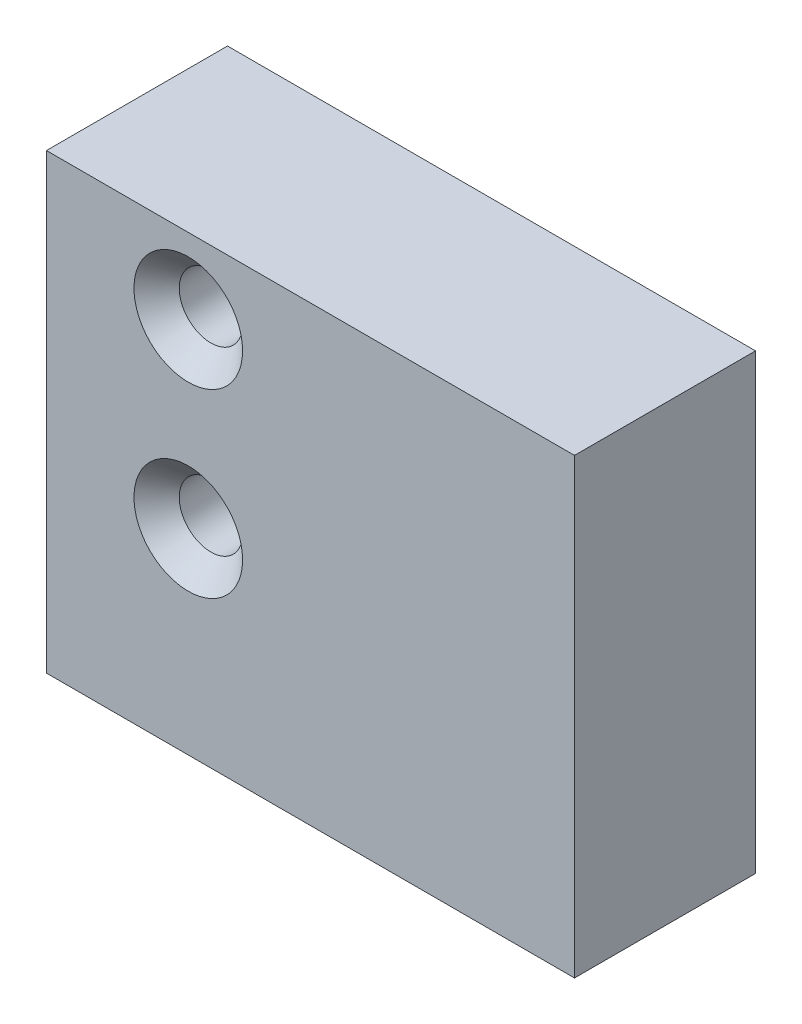
ISO-10303-21;
HEADER;
FILE_DESCRIPTION(('STEP AP214'),'2;1');
FILE_NAME('part.step','',(''),(''),'','','');
FILE_SCHEMA(('AUTOMOTIVE_DESIGN { 1 0 10303 214 1 1 1 1 }'));
ENDSEC;
DATA;
#1=APPLICATION_CONTEXT('core data for automotive mechanical design processes');
#2=APPLICATION_PROTOCOL_DEFINITION('international standard','automotive_design',2000,#1);
#3=PRODUCT_CONTEXT('',#1,'mechanical');
#4=PRODUCT('Part','Part','',(#3));
#5=PRODUCT_RELATED_PRODUCT_CATEGORY('part','',(#4));
#6=PRODUCT_DEFINITION_FORMATION('','',#4);
#7=PRODUCT_DEFINITION_CONTEXT('part definition',#1,'design');
#8=PRODUCT_DEFINITION('design','',#6,#7);
#9=PRODUCT_DEFINITION_SHAPE('','',#8);
#10=(LENGTH_UNIT() NAMED_UNIT(*) SI_UNIT(.MILLI.,.METRE.));
#11=(NAMED_UNIT(*) PLANE_ANGLE_UNIT() SI_UNIT($,.RADIAN.));
#12=(NAMED_UNIT(*) SI_UNIT($,.STERADIAN.) SOLID_ANGLE_UNIT());
#13=UNCERTAINTY_MEASURE_WITH_UNIT(LENGTH_MEASURE(1.E-05),#10,'distance_accuracy_value','');
#14=(GEOMETRIC_REPRESENTATION_CONTEXT(3) GLOBAL_UNCERTAINTY_ASSIGNED_CONTEXT((#13)) GLOBAL_UNIT_ASSIGNED_CONTEXT((#10,
#11,#12)) REPRESENTATION_CONTEXT('',''));
#15=CARTESIAN_POINT('',(0.,0.,0.));
#16=DIRECTION('',(0.,0.,1.));
#17=DIRECTION('',(1.,0.,0.));
#18=AXIS2_PLACEMENT_3D('',#15,#16,#17);
#19=CARTESIAN_POINT('',(101.930382681358,18.1630195505022,12.));
#20=DIRECTION('',(1.,0.,0.));
#21=DIRECTION('',(0.,0.,-1.));
#22=AXIS2_PLACEMENT_3D('',#19,#20,#21);
#23=PLANE('',#22);
#24=DIRECTION('',(0.,-1.,0.));
#25=VECTOR('',#24,1.);
#26=CARTESIAN_POINT('',(101.930382681358,18.1630195505022,0.));
#27=LINE('',#26,#25);
#28=CARTESIAN_POINT('',(101.930382681358,18.1630195505022,0.));
#29=VERTEX_POINT('',#28);
#30=CARTESIAN_POINT('',(101.930382681358,-11.8369804494978,0.));
#31=VERTEX_POINT('',#30);
#32=EDGE_CURVE('E94',#29,#31,#27,.T.);
#33=ORIENTED_EDGE('',*,*,#32,.T.);
#34=DIRECTION('',(0.,0.,-1.));
#35=VECTOR('',#34,1.);
#36=CARTESIAN_POINT('',(101.930382681358,-11.8369804494978,12.));
#37=LINE('',#36,#35);
#38=CARTESIAN_POINT('',(101.930382681358,-11.8369804494978,12.));
#39=VERTEX_POINT('',#38);
#40=EDGE_CURVE('E118',#39,#31,#37,.T.);
#41=ORIENTED_EDGE('',*,*,#40,.F.);
#42=DIRECTION('',(0.,-1.,0.));
#43=VECTOR('',#42,1.);
#44=CARTESIAN_POINT('',(101.930382681358,18.1630195505022,12.));
#45=LINE('',#44,#43);
#46=CARTESIAN_POINT('',(101.930382681358,18.1630195505022,12.));
#47=VERTEX_POINT('',#46);
#48=EDGE_CURVE('E103',#47,#39,#45,.T.);
#49=ORIENTED_EDGE('',*,*,#48,.F.);
#50=DIRECTION('',(0.,0.,-1.));
#51=VECTOR('',#50,1.);
#52=CARTESIAN_POINT('',(101.930382681358,18.1630195505022,12.));
#53=LINE('',#52,#51);
#54=EDGE_CURVE('E108',#47,#29,#53,.T.);
#55=ORIENTED_EDGE('',*,*,#54,.T.);
#56=EDGE_LOOP('',(#33,#41,#49,#55));
#57=FACE_BOUND('',#56,.T.);
#58=ADVANCED_FACE('F31',(#57),#23,.F.);
#59=CARTESIAN_POINT('',(101.930382681358,-11.8369804494978,12.));
#60=DIRECTION('',(0.,1.,0.));
#61=DIRECTION('',(0.,0.,1.));
#62=AXIS2_PLACEMENT_3D('',#59,#60,#61);
#63=PLANE('',#62);
#64=CARTESIAN_POINT('',(130.930382681358,-11.8369804494978,6.));
#65=DIRECTION('',(0.,-1.,0.));
#66=DIRECTION('',(0.,0.,-1.));
#67=AXIS2_PLACEMENT_3D('',#64,#65,#66);
#68=CIRCLE('',#67,2.09999999999999);
#69=CARTESIAN_POINT('',(130.930382681358,-11.8369804494978,3.90000000000001));
#70=VERTEX_POINT('',#69);
#71=EDGE_CURVE('E95',#70,#70,#68,.T.);
#72=ORIENTED_EDGE('',*,*,#71,.F.);
#73=EDGE_LOOP('',(#72));
#74=FACE_BOUND('',#73,.T.);
#75=DIRECTION('',(1.,0.,0.));
#76=VECTOR('',#75,1.);
#77=CARTESIAN_POINT('',(101.930382681358,-11.8369804494978,0.));
#78=LINE('',#77,#76);
#79=CARTESIAN_POINT('',(136.930382681358,-11.8369804494978,0.));
#80=VERTEX_POINT('',#79);
#81=EDGE_CURVE('E98',#31,#80,#78,.T.);
#82=ORIENTED_EDGE('',*,*,#81,.T.);
#83=DIRECTION('',(0.,0.,-1.));
#84=VECTOR('',#83,1.);
#85=CARTESIAN_POINT('',(136.930382681358,-11.8369804494978,12.));
#86=LINE('',#85,#84);
#87=CARTESIAN_POINT('',(136.930382681358,-11.8369804494978,12.));
#88=VERTEX_POINT('',#87);
#89=EDGE_CURVE('E116',#88,#80,#86,.T.);
#90=ORIENTED_EDGE('',*,*,#89,.F.);
#91=DIRECTION('',(1.,0.,0.));
#92=VECTOR('',#91,1.);
#93=CARTESIAN_POINT('',(101.930382681358,-11.8369804494978,12.));
#94=LINE('',#93,#92);
#95=EDGE_CURVE('E80',#39,#88,#94,.T.);
#96=ORIENTED_EDGE('',*,*,#95,.F.);
#97=ORIENTED_EDGE('',*,*,#40,.T.);
#98=EDGE_LOOP('',(#82,#90,#96,#97));
#99=FACE_BOUND('',#98,.T.);
#100=ADVANCED_FACE('F153',(#74,#99),#63,.F.);
#101=CARTESIAN_POINT('',(136.930382681358,18.1630195505022,12.));
#102=DIRECTION('',(-1.,0.,0.));
#103=DIRECTION('',(0.,0.,1.));
#104=AXIS2_PLACEMENT_3D('',#101,#102,#103);
#105=PLANE('',#104);
#106=DIRECTION('',(0.,1.,0.));
#107=VECTOR('',#106,1.);
#108=CARTESIAN_POINT('',(136.930382681358,18.1630195505022,0.));
#109=LINE('',#108,#107);
#110=CARTESIAN_POINT('',(136.930382681358,18.1630195505022,0.));
#111=VERTEX_POINT('',#110);
#112=EDGE_CURVE('E66',#80,#111,#109,.T.);
#113=ORIENTED_EDGE('',*,*,#112,.T.);
#114=DIRECTION('',(0.,0.,-1.));
#115=VECTOR('',#114,1.);
#116=CARTESIAN_POINT('',(136.930382681358,18.1630195505022,12.));
#117=LINE('',#116,#115);
#118=CARTESIAN_POINT('',(136.930382681358,18.1630195505022,12.));
#119=VERTEX_POINT('',#118);
#120=EDGE_CURVE('E114',#119,#111,#117,.T.);
#121=ORIENTED_EDGE('',*,*,#120,.F.);
#122=DIRECTION('',(0.,1.,0.));
#123=VECTOR('',#122,1.);
#124=CARTESIAN_POINT('',(136.930382681358,18.1630195505022,12.));
#125=LINE('',#124,#123);
#126=EDGE_CURVE('E106',#88,#119,#125,.T.);
#127=ORIENTED_EDGE('',*,*,#126,.F.);
#128=ORIENTED_EDGE('',*,*,#89,.T.);
#129=EDGE_LOOP('',(#113,#121,#127,#128));
#130=FACE_BOUND('',#129,.T.);
#131=ADVANCED_FACE('F159',(#130),#105,.F.);
#132=CARTESIAN_POINT('',(101.930382681358,18.1630195505022,12.));
#133=DIRECTION('',(0.,-1.,0.));
#134=DIRECTION('',(0.,0.,-1.));
#135=AXIS2_PLACEMENT_3D('',#132,#133,#134);
#136=PLANE('',#135);
#137=DIRECTION('',(-1.,0.,0.));
#138=VECTOR('',#137,1.);
#139=CARTESIAN_POINT('',(101.930382681358,18.1630195505022,0.));
#140=LINE('',#139,#138);
#141=EDGE_CURVE('E72',#111,#29,#140,.T.);
#142=ORIENTED_EDGE('',*,*,#141,.T.);
#143=ORIENTED_EDGE('',*,*,#54,.F.);
#144=DIRECTION('',(-1.,0.,0.));
#145=VECTOR('',#144,1.);
#146=CARTESIAN_POINT('',(101.930382681358,18.1630195505022,12.));
#147=LINE('',#146,#145);
#148=EDGE_CURVE('E48',#119,#47,#147,.T.);
#149=ORIENTED_EDGE('',*,*,#148,.F.);
#150=ORIENTED_EDGE('',*,*,#120,.T.);
#151=EDGE_LOOP('',(#142,#143,#149,#150));
#152=FACE_BOUND('',#151,.T.);
#153=ADVANCED_FACE('F190',(#152),#136,.F.);
#154=CARTESIAN_POINT('',(101.930382681358,-11.8369804494978,12.));
#155=DIRECTION('',(0.,0.,1.));
#156=DIRECTION('',(1.,0.,0.));
#157=AXIS2_PLACEMENT_3D('',#154,#155,#156);
#158=PLANE('',#157);
#159=CARTESIAN_POINT('',(111.330382681358,1.1630195505022,12.));
#160=DIRECTION('',(0.,0.,1.));
#161=DIRECTION('',(1.,0.,0.));
#162=AXIS2_PLACEMENT_3D('',#159,#160,#161);
#163=CIRCLE('',#162,3.59999999999998);
#164=CARTESIAN_POINT('',(114.930382681358,1.1630195505022,12.));
#165=VERTEX_POINT('',#164);
#166=EDGE_CURVE('E126',#165,#165,#163,.F.);
#167=ORIENTED_EDGE('',*,*,#166,.T.);
#168=EDGE_LOOP('',(#167));
#169=FACE_BOUND('',#168,.T.);
#170=CARTESIAN_POINT('',(111.330382681358,13.1630195505022,12.));
#171=DIRECTION('',(0.,0.,1.));
#172=DIRECTION('',(1.,0.,0.));
#173=AXIS2_PLACEMENT_3D('',#170,#171,#172);
#174=CIRCLE('',#173,3.59999999999998);
#175=CARTESIAN_POINT('',(114.930382681358,13.1630195505022,12.));
#176=VERTEX_POINT('',#175);
#177=EDGE_CURVE('E123',#176,#176,#174,.F.);
#178=ORIENTED_EDGE('',*,*,#177,.T.);
#179=EDGE_LOOP('',(#178));
#180=FACE_BOUND('',#179,.T.);
#181=ORIENTED_EDGE('',*,*,#48,.T.);
#182=ORIENTED_EDGE('',*,*,#95,.T.);
#183=ORIENTED_EDGE('',*,*,#126,.T.);
#184=ORIENTED_EDGE('',*,*,#148,.T.);
#185=EDGE_LOOP('',(#181,#182,#183,#184));
#186=FACE_BOUND('',#185,.T.);
#187=ADVANCED_FACE('F187',(#169,#180,#186),#158,.T.);
#188=CARTESIAN_POINT('',(101.930382681358,-11.8369804494978,0.));
#189=DIRECTION('',(0.,0.,1.));
#190=DIRECTION('',(1.,0.,0.));
#191=AXIS2_PLACEMENT_3D('',#188,#189,#190);
#192=PLANE('',#191);
#193=CARTESIAN_POINT('',(111.330382681358,13.1630195505022,0.));
#194=DIRECTION('',(0.,0.,1.));
#195=DIRECTION('',(1.,0.,0.));
#196=AXIS2_PLACEMENT_3D('',#193,#194,#195);
#197=CIRCLE('',#196,3.60000000000001);
#198=CARTESIAN_POINT('',(114.930382681358,13.1630195505022,0.));
#199=VERTEX_POINT('',#198);
#200=EDGE_CURVE('E40',#199,#199,#197,.T.);
#201=ORIENTED_EDGE('',*,*,#200,.T.);
#202=EDGE_LOOP('',(#201));
#203=FACE_BOUND('',#202,.T.);
#204=CARTESIAN_POINT('',(111.330382681358,1.1630195505022,0.));
#205=DIRECTION('',(0.,0.,1.));
#206=DIRECTION('',(1.,0.,0.));
#207=AXIS2_PLACEMENT_3D('',#204,#205,#206);
#208=CIRCLE('',#207,3.60000000000001);
#209=CARTESIAN_POINT('',(114.930382681358,1.1630195505022,0.));
#210=VERTEX_POINT('',#209);
#211=EDGE_CURVE('E132',#210,#210,#208,.T.);
#212=ORIENTED_EDGE('',*,*,#211,.T.);
#213=EDGE_LOOP('',(#212));
#214=FACE_BOUND('',#213,.T.);
#215=ORIENTED_EDGE('',*,*,#32,.F.);
#216=ORIENTED_EDGE('',*,*,#141,.F.);
#217=ORIENTED_EDGE('',*,*,#112,.F.);
#218=ORIENTED_EDGE('',*,*,#81,.F.);
#219=EDGE_LOOP('',(#215,#216,#217,#218));
#220=FACE_BOUND('',#219,.T.);
#221=ADVANCED_FACE('F140',(#203,#214,#220),#192,.F.);
#222=CARTESIAN_POINT('',(111.330382681358,1.1630195505022,12.));
#223=DIRECTION('',(0.,0.,1.));
#224=DIRECTION('',(1.,0.,0.));
#225=AXIS2_PLACEMENT_3D('',#222,#223,#224);
#226=CYLINDRICAL_SURFACE('',#225,2.1);
#227=CARTESIAN_POINT('',(111.330382681358,1.1630195505022,1.49999999999999));
#228=DIRECTION('',(0.,0.,1.));
#229=DIRECTION('',(1.,0.,0.));
#230=AXIS2_PLACEMENT_3D('',#227,#228,#229);
#231=CIRCLE('',#230,2.1);
#232=CARTESIAN_POINT('',(113.430382681358,1.1630195505022,1.49999999999999));
#233=VERTEX_POINT('',#232);
#234=EDGE_CURVE('E135',#233,#233,#231,.F.);
#235=ORIENTED_EDGE('',*,*,#234,.T.);
#236=EDGE_LOOP('',(#235));
#237=FACE_BOUND('',#236,.T.);
#238=CARTESIAN_POINT('',(111.330382681358,1.1630195505022,10.5));
#239=DIRECTION('',(0.,0.,1.));
#240=DIRECTION('',(1.,0.,0.));
#241=AXIS2_PLACEMENT_3D('',#238,#239,#240);
#242=CIRCLE('',#241,2.1);
#243=CARTESIAN_POINT('',(113.430382681358,1.1630195505022,10.5));
#244=VERTEX_POINT('',#243);
#245=EDGE_CURVE('E120',#244,#244,#242,.T.);
#246=ORIENTED_EDGE('',*,*,#245,.T.);
#247=EDGE_LOOP('',(#246));
#248=FACE_BOUND('',#247,.T.);
#249=ADVANCED_FACE('F177',(#237,#248),#226,.F.);
#250=CARTESIAN_POINT('',(111.330382681358,13.1630195505022,12.));
#251=DIRECTION('',(0.,0.,1.));
#252=DIRECTION('',(1.,0.,0.));
#253=AXIS2_PLACEMENT_3D('',#250,#251,#252);
#254=CYLINDRICAL_SURFACE('',#253,2.1);
#255=CARTESIAN_POINT('',(111.330382681358,13.1630195505022,1.49999999999999));
#256=DIRECTION('',(0.,0.,1.));
#257=DIRECTION('',(1.,0.,0.));
#258=AXIS2_PLACEMENT_3D('',#255,#256,#257);
#259=CIRCLE('',#258,2.1);
#260=CARTESIAN_POINT('',(113.430382681358,13.1630195505022,1.49999999999999));
#261=VERTEX_POINT('',#260);
#262=EDGE_CURVE('E11',#261,#261,#259,.F.);
#263=ORIENTED_EDGE('',*,*,#262,.T.);
#264=EDGE_LOOP('',(#263));
#265=FACE_BOUND('',#264,.T.);
#266=CARTESIAN_POINT('',(111.330382681358,13.1630195505022,10.5));
#267=DIRECTION('',(0.,0.,1.));
#268=DIRECTION('',(1.,0.,0.));
#269=AXIS2_PLACEMENT_3D('',#266,#267,#268);
#270=CIRCLE('',#269,2.1);
#271=CARTESIAN_POINT('',(113.430382681358,13.1630195505022,10.5));
#272=VERTEX_POINT('',#271);
#273=EDGE_CURVE('E129',#272,#272,#270,.T.);
#274=ORIENTED_EDGE('',*,*,#273,.T.);
#275=EDGE_LOOP('',(#274));
#276=FACE_BOUND('',#275,.T.);
#277=ADVANCED_FACE('F88',(#265,#276),#254,.F.);
#278=CARTESIAN_POINT('',(130.930382681358,8.16301955050223,6.));
#279=DIRECTION('',(0.,-1.,0.));
#280=DIRECTION('',(0.,0.,-1.));
#281=AXIS2_PLACEMENT_3D('',#278,#279,#280);
#282=CONICAL_SURFACE('',#281,2.09999999999999,1.02974425867665);
#283=CARTESIAN_POINT('',(130.930382681358,9.42482685046011,6.));
#284=VERTEX_POINT('',#283);
#285=VERTEX_LOOP('',#284);
#286=FACE_BOUND('',#285,.T.);
#287=CARTESIAN_POINT('',(130.930382681358,8.16301955050223,6.));
#288=DIRECTION('',(0.,-1.,0.));
#289=DIRECTION('',(0.,0.,-1.));
#290=AXIS2_PLACEMENT_3D('',#287,#288,#289);
#291=CIRCLE('',#290,2.09999999999999);
#292=CARTESIAN_POINT('',(130.930382681358,8.16301955050223,3.90000000000001));
#293=VERTEX_POINT('',#292);
#294=EDGE_CURVE('E92',#293,#293,#291,.T.);
#295=ORIENTED_EDGE('',*,*,#294,.T.);
#296=EDGE_LOOP('',(#295));
#297=FACE_BOUND('',#296,.T.);
#298=ADVANCED_FACE('F84',(#286,#297),#282,.F.);
#299=CARTESIAN_POINT('',(130.930382681358,-11.8369804494978,6.));
#300=DIRECTION('',(0.,-1.,0.));
#301=DIRECTION('',(0.,0.,-1.));
#302=AXIS2_PLACEMENT_3D('',#299,#300,#301);
#303=CYLINDRICAL_SURFACE('',#302,2.09999999999999);
#304=ORIENTED_EDGE('',*,*,#294,.F.);
#305=EDGE_LOOP('',(#304));
#306=FACE_BOUND('',#305,.T.);
#307=ORIENTED_EDGE('',*,*,#71,.T.);
#308=EDGE_LOOP('',(#307));
#309=FACE_BOUND('',#308,.T.);
#310=ADVANCED_FACE('F87',(#306,#309),#303,.F.);
#311=CARTESIAN_POINT('',(111.330382681358,1.1630195505022,10.5));
#312=DIRECTION('',(0.,0.,1.));
#313=DIRECTION('',(1.,0.,0.));
#314=AXIS2_PLACEMENT_3D('',#311,#312,#313);
#315=CONICAL_SURFACE('',#314,2.1,0.785398163397446);
#316=CARTESIAN_POINT('',(114.930382681358,1.1630195505022,12.));
#317=CARTESIAN_POINT('',(114.914757681358,1.1630195505022,11.984375));
#318=CARTESIAN_POINT('',(114.899132681358,1.1630195505022,11.96875));
#319=CARTESIAN_POINT('',(114.867882681358,1.1630195505022,11.9375));
#320=CARTESIAN_POINT('',(114.852257681358,1.1630195505022,11.921875));
#321=CARTESIAN_POINT('',(114.821007681358,1.1630195505022,11.890625));
#322=CARTESIAN_POINT('',(114.805382681358,1.1630195505022,11.875));
#323=CARTESIAN_POINT('',(114.774132681358,1.1630195505022,11.84375));
#324=CARTESIAN_POINT('',(114.758507681358,1.1630195505022,11.828125));
#325=CARTESIAN_POINT('',(114.727257681358,1.1630195505022,11.796875));
#326=CARTESIAN_POINT('',(114.711632681358,1.1630195505022,11.78125));
#327=CARTESIAN_POINT('',(114.680382681358,1.1630195505022,11.75));
#328=CARTESIAN_POINT('',(114.664757681358,1.1630195505022,11.734375));
#329=CARTESIAN_POINT('',(114.633507681358,1.1630195505022,11.703125));
#330=CARTESIAN_POINT('',(114.617882681358,1.1630195505022,11.6875));
#331=CARTESIAN_POINT('',(114.586632681358,1.1630195505022,11.65625));
#332=CARTESIAN_POINT('',(114.571007681358,1.1630195505022,11.640625));
#333=CARTESIAN_POINT('',(114.539757681358,1.1630195505022,11.609375));
#334=CARTESIAN_POINT('',(114.524132681358,1.1630195505022,11.59375));
#335=CARTESIAN_POINT('',(114.492882681358,1.1630195505022,11.5625));
#336=CARTESIAN_POINT('',(114.477257681358,1.1630195505022,11.546875));
#337=CARTESIAN_POINT('',(114.446007681358,1.1630195505022,11.515625));
#338=CARTESIAN_POINT('',(114.430382681358,1.1630195505022,11.5));
#339=CARTESIAN_POINT('',(114.399132681358,1.1630195505022,11.46875));
#340=CARTESIAN_POINT('',(114.383507681358,1.1630195505022,11.453125));
#341=CARTESIAN_POINT('',(114.352257681358,1.1630195505022,11.421875));
#342=CARTESIAN_POINT('',(114.336632681358,1.1630195505022,11.40625));
#343=CARTESIAN_POINT('',(114.305382681358,1.1630195505022,11.375));
#344=CARTESIAN_POINT('',(114.289757681358,1.1630195505022,11.359375));
#345=CARTESIAN_POINT('',(114.258507681358,1.1630195505022,11.328125));
#346=CARTESIAN_POINT('',(114.242882681358,1.1630195505022,11.3125));
#347=CARTESIAN_POINT('',(114.211632681358,1.1630195505022,11.28125));
#348=CARTESIAN_POINT('',(114.196007681358,1.1630195505022,11.265625));
#349=CARTESIAN_POINT('',(114.164757681358,1.1630195505022,11.234375));
#350=CARTESIAN_POINT('',(114.149132681358,1.1630195505022,11.21875));
#351=CARTESIAN_POINT('',(114.117882681358,1.1630195505022,11.1875));
#352=CARTESIAN_POINT('',(114.102257681358,1.1630195505022,11.171875));
#353=CARTESIAN_POINT('',(114.071007681358,1.1630195505022,11.140625));
#354=CARTESIAN_POINT('',(114.055382681358,1.1630195505022,11.125));
#355=CARTESIAN_POINT('',(114.024132681358,1.1630195505022,11.09375));
#356=CARTESIAN_POINT('',(114.008507681358,1.1630195505022,11.078125));
#357=CARTESIAN_POINT('',(113.977257681358,1.1630195505022,11.046875));
#358=CARTESIAN_POINT('',(113.961632681358,1.1630195505022,11.03125));
#359=CARTESIAN_POINT('',(113.930382681358,1.1630195505022,11.));
#360=CARTESIAN_POINT('',(113.914757681358,1.1630195505022,10.984375));
#361=CARTESIAN_POINT('',(113.883507681358,1.1630195505022,10.953125));
#362=CARTESIAN_POINT('',(113.867882681358,1.1630195505022,10.9375));
#363=CARTESIAN_POINT('',(113.836632681358,1.1630195505022,10.90625));
#364=CARTESIAN_POINT('',(113.821007681358,1.1630195505022,10.890625));
#365=CARTESIAN_POINT('',(113.789757681358,1.1630195505022,10.859375));
#366=CARTESIAN_POINT('',(113.774132681358,1.1630195505022,10.84375));
#367=CARTESIAN_POINT('',(113.742882681358,1.1630195505022,10.8125));
#368=CARTESIAN_POINT('',(113.727257681358,1.1630195505022,10.796875));
#369=CARTESIAN_POINT('',(113.696007681358,1.1630195505022,10.765625));
#370=CARTESIAN_POINT('',(113.680382681358,1.1630195505022,10.75));
#371=CARTESIAN_POINT('',(113.649132681358,1.1630195505022,10.71875));
#372=CARTESIAN_POINT('',(113.633507681358,1.1630195505022,10.703125));
#373=CARTESIAN_POINT('',(113.602257681358,1.1630195505022,10.671875));
#374=CARTESIAN_POINT('',(113.586632681358,1.1630195505022,10.65625));
#375=CARTESIAN_POINT('',(113.555382681358,1.1630195505022,10.625));
#376=CARTESIAN_POINT('',(113.539757681358,1.1630195505022,10.609375));
#377=CARTESIAN_POINT('',(113.508507681358,1.1630195505022,10.578125));
#378=CARTESIAN_POINT('',(113.492882681358,1.1630195505022,10.5625));
#379=CARTESIAN_POINT('',(113.461632681358,1.1630195505022,10.53125));
#380=CARTESIAN_POINT('',(113.446007681358,1.1630195505022,10.515625));
#381=CARTESIAN_POINT('',(113.430382681358,1.1630195505022,10.5));
#382=B_SPLINE_CURVE_WITH_KNOTS('',3,(#316,#317,#318,#319,#320,#321,#322,#323,#324,#325,#326,
#327,#328,#329,#330,#331,#332,#333,#334,#335,#336,#337,#338,#339,#340,#341,#342,#343,#344,#345,
#346,#347,#348,#349,#350,#351,#352,#353,#354,#355,#356,#357,#358,#359,#360,#361,#362,#363,#364,
#365,#366,#367,#368,#369,#370,#371,#372,#373,#374,#375,#376,#377,#378,#379,#380,#381),
.UNSPECIFIED.,.F.,.F.,(4,2,2,2,2,2,2,2,2,2,2,2,2,2,2,2,2,2,2,2,2,2,2,2,2,2,2,2,2,2,2,2,4),(0.,
0.0662912607362389,0.132582521472479,0.198873782208719,0.265165042944949,0.331456303681188,
0.397747564417428,0.464038825153669,0.530330085889909,0.596621346626138,0.662912607362378,
0.729203868098618,0.795495128834858,0.861786389571097,0.928077650307337,0.994368911043567,
1.06066017177981,1.12695143251605,1.19324269325229,1.25953395398853,1.32582521472477,
1.392116475461,1.45840773619724,1.52469899693348,1.59099025766972,1.65728151840595,
1.7235727791422,1.78986403987843,1.85615530061467,1.9224465613509,1.98873782208714,
2.05502908282338,2.12132034355962),.UNSPECIFIED.);
#383=EDGE_CURVE('BSEAM164',#165,#244,#382,.T.);
#384=ORIENTED_EDGE('',*,*,#166,.F.);
#385=ORIENTED_EDGE('',*,*,#245,.F.);
#386=ORIENTED_EDGE('',*,*,#383,.T.);
#387=ORIENTED_EDGE('',*,*,#383,.F.);
#388=EDGE_LOOP('',(#384,#386,#385,#387));
#389=FACE_BOUND('',#388,.T.);
#390=ADVANCED_FACE('F164',(#389),#315,.F.);
#391=CARTESIAN_POINT('',(111.330382681358,13.1630195505022,10.5));
#392=DIRECTION('',(0.,0.,1.));
#393=DIRECTION('',(1.,0.,0.));
#394=AXIS2_PLACEMENT_3D('',#391,#392,#393);
#395=CONICAL_SURFACE('',#394,2.1,0.785398163397446);
#396=CARTESIAN_POINT('',(114.930382681358,13.1630195505022,12.));
#397=CARTESIAN_POINT('',(114.914757681358,13.1630195505022,11.984375));
#398=CARTESIAN_POINT('',(114.899132681358,13.1630195505022,11.96875));
#399=CARTESIAN_POINT('',(114.867882681358,13.1630195505022,11.9375));
#400=CARTESIAN_POINT('',(114.852257681358,13.1630195505022,11.921875));
#401=CARTESIAN_POINT('',(114.821007681358,13.1630195505022,11.890625));
#402=CARTESIAN_POINT('',(114.805382681358,13.1630195505022,11.875));
#403=CARTESIAN_POINT('',(114.774132681358,13.1630195505022,11.84375));
#404=CARTESIAN_POINT('',(114.758507681358,13.1630195505022,11.828125));
#405=CARTESIAN_POINT('',(114.727257681358,13.1630195505022,11.796875));
#406=CARTESIAN_POINT('',(114.711632681358,13.1630195505022,11.78125));
#407=CARTESIAN_POINT('',(114.680382681358,13.1630195505022,11.75));
#408=CARTESIAN_POINT('',(114.664757681358,13.1630195505022,11.734375));
#409=CARTESIAN_POINT('',(114.633507681358,13.1630195505022,11.703125));
#410=CARTESIAN_POINT('',(114.617882681358,13.1630195505022,11.6875));
#411=CARTESIAN_POINT('',(114.586632681358,13.1630195505022,11.65625));
#412=CARTESIAN_POINT('',(114.571007681358,13.1630195505022,11.640625));
#413=CARTESIAN_POINT('',(114.539757681358,13.1630195505022,11.609375));
#414=CARTESIAN_POINT('',(114.524132681358,13.1630195505022,11.59375));
#415=CARTESIAN_POINT('',(114.492882681358,13.1630195505022,11.5625));
#416=CARTESIAN_POINT('',(114.477257681358,13.1630195505022,11.546875));
#417=CARTESIAN_POINT('',(114.446007681358,13.1630195505022,11.515625));
#418=CARTESIAN_POINT('',(114.430382681358,13.1630195505022,11.5));
#419=CARTESIAN_POINT('',(114.399132681358,13.1630195505022,11.46875));
#420=CARTESIAN_POINT('',(114.383507681358,13.1630195505022,11.453125));
#421=CARTESIAN_POINT('',(114.352257681358,13.1630195505022,11.421875));
#422=CARTESIAN_POINT('',(114.336632681358,13.1630195505022,11.40625));
#423=CARTESIAN_POINT('',(114.305382681358,13.1630195505022,11.375));
#424=CARTESIAN_POINT('',(114.289757681358,13.1630195505022,11.359375));
#425=CARTESIAN_POINT('',(114.258507681358,13.1630195505022,11.328125));
#426=CARTESIAN_POINT('',(114.242882681358,13.1630195505022,11.3125));
#427=CARTESIAN_POINT('',(114.211632681358,13.1630195505022,11.28125));
#428=CARTESIAN_POINT('',(114.196007681358,13.1630195505022,11.265625));
#429=CARTESIAN_POINT('',(114.164757681358,13.1630195505022,11.234375));
#430=CARTESIAN_POINT('',(114.149132681358,13.1630195505022,11.21875));
#431=CARTESIAN_POINT('',(114.117882681358,13.1630195505022,11.1875));
#432=CARTESIAN_POINT('',(114.102257681358,13.1630195505022,11.171875));
#433=CARTESIAN_POINT('',(114.071007681358,13.1630195505022,11.140625));
#434=CARTESIAN_POINT('',(114.055382681358,13.1630195505022,11.125));
#435=CARTESIAN_POINT('',(114.024132681358,13.1630195505022,11.09375));
#436=CARTESIAN_POINT('',(114.008507681358,13.1630195505022,11.078125));
#437=CARTESIAN_POINT('',(113.977257681358,13.1630195505022,11.046875));
#438=CARTESIAN_POINT('',(113.961632681358,13.1630195505022,11.03125));
#439=CARTESIAN_POINT('',(113.930382681358,13.1630195505022,11.));
#440=CARTESIAN_POINT('',(113.914757681358,13.1630195505022,10.984375));
#441=CARTESIAN_POINT('',(113.883507681358,13.1630195505022,10.953125));
#442=CARTESIAN_POINT('',(113.867882681358,13.1630195505022,10.9375));
#443=CARTESIAN_POINT('',(113.836632681358,13.1630195505022,10.90625));
#444=CARTESIAN_POINT('',(113.821007681358,13.1630195505022,10.890625));
#445=CARTESIAN_POINT('',(113.789757681358,13.1630195505022,10.859375));
#446=CARTESIAN_POINT('',(113.774132681358,13.1630195505022,10.84375));
#447=CARTESIAN_POINT('',(113.742882681358,13.1630195505022,10.8125));
#448=CARTESIAN_POINT('',(113.727257681358,13.1630195505022,10.796875));
#449=CARTESIAN_POINT('',(113.696007681358,13.1630195505022,10.765625));
#450=CARTESIAN_POINT('',(113.680382681358,13.1630195505022,10.75));
#451=CARTESIAN_POINT('',(113.649132681358,13.1630195505022,10.71875));
#452=CARTESIAN_POINT('',(113.633507681358,13.1630195505022,10.703125));
#453=CARTESIAN_POINT('',(113.602257681358,13.1630195505022,10.671875));
#454=CARTESIAN_POINT('',(113.586632681358,13.1630195505022,10.65625));
#455=CARTESIAN_POINT('',(113.555382681358,13.1630195505022,10.625));
#456=CARTESIAN_POINT('',(113.539757681358,13.1630195505022,10.609375));
#457=CARTESIAN_POINT('',(113.508507681358,13.1630195505022,10.578125));
#458=CARTESIAN_POINT('',(113.492882681358,13.1630195505022,10.5625));
#459=CARTESIAN_POINT('',(113.461632681358,13.1630195505022,10.53125));
#460=CARTESIAN_POINT('',(113.446007681358,13.1630195505022,10.515625));
#461=CARTESIAN_POINT('',(113.430382681358,13.1630195505022,10.5));
#462=B_SPLINE_CURVE_WITH_KNOTS('',3,(#396,#397,#398,#399,#400,#401,#402,#403,#404,#405,#406,
#407,#408,#409,#410,#411,#412,#413,#414,#415,#416,#417,#418,#419,#420,#421,#422,#423,#424,#425,
#426,#427,#428,#429,#430,#431,#432,#433,#434,#435,#436,#437,#438,#439,#440,#441,#442,#443,#444,
#445,#446,#447,#448,#449,#450,#451,#452,#453,#454,#455,#456,#457,#458,#459,#460,#461),
.UNSPECIFIED.,.F.,.F.,(4,2,2,2,2,2,2,2,2,2,2,2,2,2,2,2,2,2,2,2,2,2,2,2,2,2,2,2,2,2,2,2,4),(0.,
0.0662912607362389,0.132582521472479,0.198873782208719,0.265165042944949,0.331456303681188,
0.397747564417428,0.464038825153669,0.530330085889909,0.596621346626138,0.662912607362378,
0.729203868098618,0.795495128834858,0.861786389571097,0.928077650307337,0.994368911043567,
1.06066017177981,1.12695143251605,1.19324269325229,1.25953395398853,1.32582521472477,
1.392116475461,1.45840773619724,1.52469899693348,1.59099025766972,1.65728151840595,
1.7235727791422,1.78986403987843,1.85615530061467,1.9224465613509,1.98873782208714,
2.05502908282338,2.12132034355962),.UNSPECIFIED.);
#463=EDGE_CURVE('BSEAM149',#176,#272,#462,.T.);
#464=ORIENTED_EDGE('',*,*,#177,.F.);
#465=ORIENTED_EDGE('',*,*,#273,.F.);
#466=ORIENTED_EDGE('',*,*,#463,.T.);
#467=ORIENTED_EDGE('',*,*,#463,.F.);
#468=EDGE_LOOP('',(#464,#466,#465,#467));
#469=FACE_BOUND('',#468,.T.);
#470=ADVANCED_FACE('F149',(#469),#395,.F.);
#471=CARTESIAN_POINT('',(111.330382681358,1.1630195505022,0.));
#472=DIRECTION('',(0.,0.,-1.));
#473=DIRECTION('',(-1.,0.,0.));
#474=AXIS2_PLACEMENT_3D('',#471,#472,#473);
#475=CONICAL_SURFACE('',#474,3.60000000000001,0.785398163397453);
#476=ORIENTED_EDGE('',*,*,#234,.F.);
#477=EDGE_LOOP('',(#476));
#478=FACE_BOUND('',#477,.T.);
#479=ORIENTED_EDGE('',*,*,#211,.F.);
#480=EDGE_LOOP('',(#479));
#481=FACE_BOUND('',#480,.T.);
#482=ADVANCED_FACE('F144',(#478,#481),#475,.F.);
#483=CARTESIAN_POINT('',(111.330382681358,13.1630195505022,0.));
#484=DIRECTION('',(0.,0.,-1.));
#485=DIRECTION('',(-1.,0.,0.));
#486=AXIS2_PLACEMENT_3D('',#483,#484,#485);
#487=CONICAL_SURFACE('',#486,3.60000000000001,0.785398163397453);
#488=ORIENTED_EDGE('',*,*,#262,.F.);
#489=EDGE_LOOP('',(#488));
#490=FACE_BOUND('',#489,.T.);
#491=ORIENTED_EDGE('',*,*,#200,.F.);
#492=EDGE_LOOP('',(#491));
#493=FACE_BOUND('',#492,.T.);
#494=ADVANCED_FACE('F33',(#490,#493),#487,.F.);
#495=CLOSED_SHELL('',(#58,#100,#131,#153,#187,#221,#249,#277,#298,#310,#390,#470,#482,#494));
#496=MANIFOLD_SOLID_BREP('B2',#495);
#497=ADVANCED_BREP_SHAPE_REPRESENTATION('',(#18,#496),#14);
#498=SHAPE_DEFINITION_REPRESENTATION(#9,#497);
ENDSEC;
END-ISO-10303-21;
